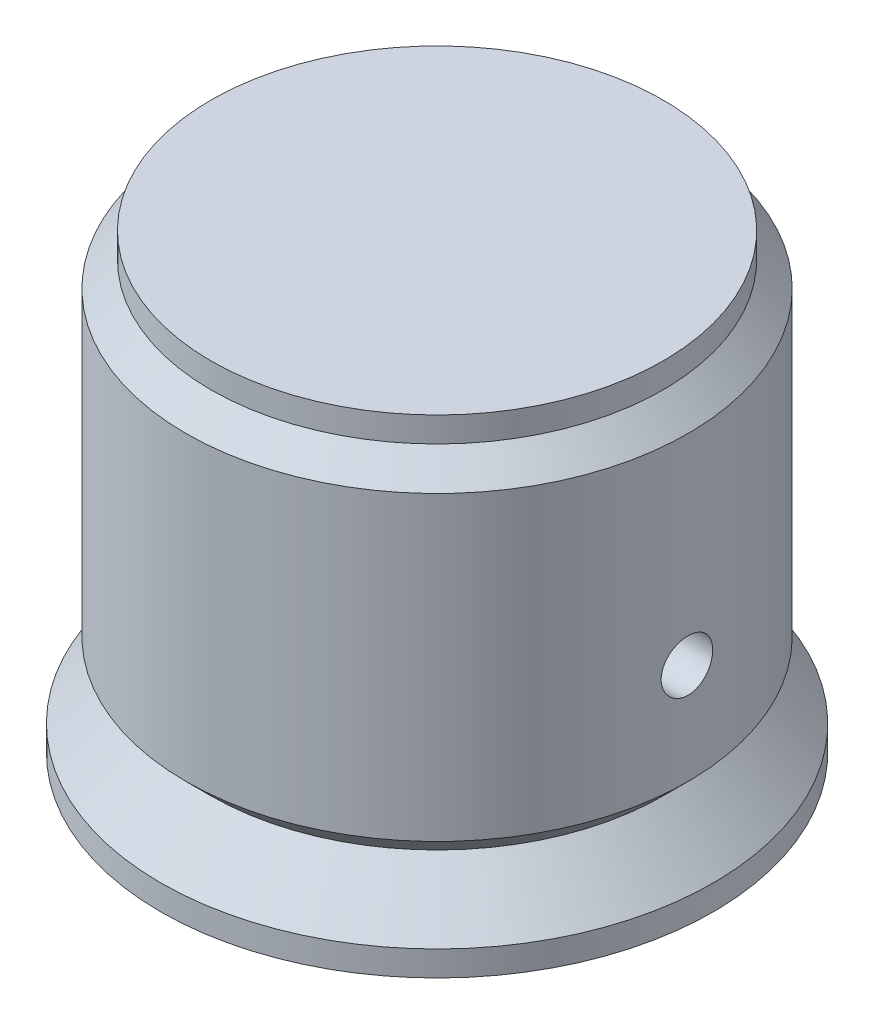
ISO-10303-21;
HEADER;
FILE_DESCRIPTION(('STEP AP214'),'2;1');
FILE_NAME('part.step','',(''),(''),'','','');
FILE_SCHEMA(('AUTOMOTIVE_DESIGN { 1 0 10303 214 1 1 1 1 }'));
ENDSEC;
DATA;
#1=APPLICATION_CONTEXT('core data for automotive mechanical design processes');
#2=APPLICATION_PROTOCOL_DEFINITION('international standard','automotive_design',2000,#1);
#3=PRODUCT_CONTEXT('',#1,'mechanical');
#4=PRODUCT('Part','Part','',(#3));
#5=PRODUCT_RELATED_PRODUCT_CATEGORY('part','',(#4));
#6=PRODUCT_DEFINITION_FORMATION('','',#4);
#7=PRODUCT_DEFINITION_CONTEXT('part definition',#1,'design');
#8=PRODUCT_DEFINITION('design','',#6,#7);
#9=PRODUCT_DEFINITION_SHAPE('','',#8);
#10=(LENGTH_UNIT() NAMED_UNIT(*) SI_UNIT(.MILLI.,.METRE.));
#11=(NAMED_UNIT(*) PLANE_ANGLE_UNIT() SI_UNIT($,.RADIAN.));
#12=(NAMED_UNIT(*) SI_UNIT($,.STERADIAN.) SOLID_ANGLE_UNIT());
#13=UNCERTAINTY_MEASURE_WITH_UNIT(LENGTH_MEASURE(1.E-05),#10,'distance_accuracy_value','');
#14=(GEOMETRIC_REPRESENTATION_CONTEXT(3) GLOBAL_UNCERTAINTY_ASSIGNED_CONTEXT((#13)) GLOBAL_UNIT_ASSIGNED_CONTEXT((#10,
#11,#12)) REPRESENTATION_CONTEXT('',''));
#15=CARTESIAN_POINT('',(0.,0.,0.));
#16=DIRECTION('',(0.,0.,1.));
#17=DIRECTION('',(1.,0.,0.));
#18=AXIS2_PLACEMENT_3D('',#15,#16,#17);
#19=CARTESIAN_POINT('',(0.,17.358883539874,0.));
#20=DIRECTION('',(0.,1.,0.));
#21=DIRECTION('',(0.,0.,1.));
#22=AXIS2_PLACEMENT_3D('',#19,#20,#21);
#23=CYLINDRICAL_SURFACE('',#22,7.9375);
#24=CARTESIAN_POINT('',(0.,12.7000000000001,0.));
#25=DIRECTION('',(0.,1.,0.));
#26=DIRECTION('',(0.,0.,1.));
#27=AXIS2_PLACEMENT_3D('',#24,#25,#26);
#28=CIRCLE('',#27,7.9375);
#29=CARTESIAN_POINT('',(0.,12.7000000000001,7.9375));
#30=VERTEX_POINT('',#29);
#31=EDGE_CURVE('E91',#30,#30,#28,.T.);
#32=ORIENTED_EDGE('',*,*,#31,.F.);
#33=EDGE_LOOP('',(#32));
#34=FACE_BOUND('',#33,.T.);
#35=CARTESIAN_POINT('',(0.,3.17500000000007,0.));
#36=DIRECTION('',(0.,1.,0.));
#37=DIRECTION('',(0.,0.,1.));
#38=AXIS2_PLACEMENT_3D('',#35,#36,#37);
#39=CIRCLE('',#38,7.9375);
#40=CARTESIAN_POINT('',(0.,3.17500000000007,7.9375));
#41=VERTEX_POINT('',#40);
#42=EDGE_CURVE('E94',#41,#41,#39,.T.);
#43=ORIENTED_EDGE('',*,*,#42,.T.);
#44=EDGE_LOOP('',(#43));
#45=FACE_BOUND('',#44,.T.);
#46=CARTESIAN_POINT('',(7.89564413364103,6.35,0.81407));
#47=CARTESIAN_POINT('',(7.89564468109291,6.30440253163848,0.81406802790347));
#48=CARTESIAN_POINT('',(7.8960433804208,6.25877506608875,0.810226105708008));
#49=CARTESIAN_POINT('',(7.89759484298477,6.16878561354159,0.794958208801477));
#50=CARTESIAN_POINT('',(7.89874843324081,6.12442507021143,0.783523916074697));
#51=CARTESIAN_POINT('',(7.90167766577613,6.0382856499606,0.753408122480469));
#52=CARTESIAN_POINT('',(7.90345292672176,5.99650520884103,0.73473106358327));
#53=CARTESIAN_POINT('',(7.90742500512262,5.91668106859674,0.690668538459444));
#54=CARTESIAN_POINT('',(7.90962173991015,5.87863663890104,0.665284387391258));
#55=CARTESIAN_POINT('',(7.91419864213506,5.80721032888699,0.608424178152562));
#56=CARTESIAN_POINT('',(7.91657940718333,5.77384472158424,0.576927724329384));
#57=CARTESIAN_POINT('',(7.92125069791733,5.71286335306415,0.508780599064153));
#58=CARTESIAN_POINT('',(7.92354121943797,5.68524785698533,0.472129690079861));
#59=CARTESIAN_POINT('',(7.92777986870166,5.63649414413376,0.39461407702642));
#60=CARTESIAN_POINT('',(7.92972722929275,5.61537036344475,0.353740247815001));
#61=CARTESIAN_POINT('',(7.93305363178316,5.58029207284229,0.269002358732026));
#62=CARTESIAN_POINT('',(7.9344326882001,5.5663373797886,0.225138375278848));
#63=CARTESIAN_POINT('',(7.93646290396252,5.54604120719977,0.13582995424628));
#64=CARTESIAN_POINT('',(7.9371166214315,5.53967296589329,0.090391657604757));
#65=CARTESIAN_POINT('',(7.93763120651779,5.53464764980265,-0.000913173853407171));
#66=CARTESIAN_POINT('',(7.93749209567592,5.53599036551511,-0.046779697001515));
#67=CARTESIAN_POINT('',(7.93643878977762,5.54632714983542,-0.137457289458856));
#68=CARTESIAN_POINT('',(7.93552750993227,5.55529244095822,-0.182271677850242));
#69=CARTESIAN_POINT('',(7.9330356160048,5.58057503870674,-0.269756328397973));
#70=CARTESIAN_POINT('',(7.93145499284316,5.59689244506266,-0.312426561460487));
#71=CARTESIAN_POINT('',(7.92779709307406,5.63644754707735,-0.394502210185458));
#72=CARTESIAN_POINT('',(7.92571890580127,5.65969795121428,-0.4339014589602));
#73=CARTESIAN_POINT('',(7.92129900507454,5.71244982575675,-0.508249449018692));
#74=CARTESIAN_POINT('',(7.91895728348936,5.74195148906707,-0.543198052908702));
#75=CARTESIAN_POINT('',(7.91426031469714,5.80653022185264,-0.607821292190341));
#76=CARTESIAN_POINT('',(7.91190505484651,5.84163232942718,-0.637470911476628));
#77=CARTESIAN_POINT('',(7.90745720744383,5.9163287949023,-0.690460794721214));
#78=CARTESIAN_POINT('',(7.90536462030596,5.95592315988601,-0.713801048731095));
#79=CARTESIAN_POINT('',(7.90167888028008,6.03849970886544,-0.753509678935898));
#80=CARTESIAN_POINT('',(7.90008584114513,6.08148266169878,-0.769876467493099));
#81=CARTESIAN_POINT('',(7.89758189888314,6.16960656703262,-0.795153557474137));
#82=CARTESIAN_POINT('',(7.89667097387245,6.21474745025279,-0.804064098111002));
#83=CARTESIAN_POINT('',(7.89563820512157,6.30568609546005,-0.814143487815304));
#84=CARTESIAN_POINT('',(7.89551279232229,6.35147993740407,-0.815347353539361));
#85=CARTESIAN_POINT('',(7.89605582706615,6.44261744044922,-0.810071221192235));
#86=CARTESIAN_POINT('',(7.89672426331588,6.48796110794533,-0.803591332431061));
#87=CARTESIAN_POINT('',(7.89877643195743,6.57680878903016,-0.78316094552791));
#88=CARTESIAN_POINT('',(7.90015857527128,6.62031665822009,-0.769227041377777));
#89=CARTESIAN_POINT('',(7.90348113527271,6.70437763318995,-0.734301109966878));
#90=CARTESIAN_POINT('',(7.90542156538965,6.74493066786316,-0.713308912919774));
#91=CARTESIAN_POINT('',(7.9096506917656,6.82209032014653,-0.664774717531622));
#92=CARTESIAN_POINT('',(7.91194061008338,6.85868228812534,-0.637209537356879));
#93=CARTESIAN_POINT('',(7.91660671122659,6.92673245344987,-0.576345034294726));
#94=CARTESIAN_POINT('',(7.91898289629806,6.95819051701295,-0.543045562025822));
#95=CARTESIAN_POINT('',(7.92356458519669,7.01520085744043,-0.471505716259486));
#96=CARTESIAN_POINT('',(7.92576940727394,7.04073027553335,-0.43324707677102));
#97=CARTESIAN_POINT('',(7.92974999614946,7.08500125991737,-0.352965011932784));
#98=CARTESIAN_POINT('',(7.93152576909061,7.10374292339367,-0.310941640496155));
#99=CARTESIAN_POINT('',(7.93444510346951,7.13386775022716,-0.224402439116637));
#100=CARTESIAN_POINT('',(7.93558984576907,7.14526466478532,-0.179891437508692));
#101=CARTESIAN_POINT('',(7.93712298782111,7.16042134345621,-0.0895752627449945));
#102=CARTESIAN_POINT('',(7.93751141001073,7.16418133412742,-0.0437701280221218));
#103=CARTESIAN_POINT('',(7.93748812699836,7.16395415189939,0.0476096710313823));
#104=CARTESIAN_POINT('',(7.93708008447076,7.16000244254339,0.0931844286057211));
#105=CARTESIAN_POINT('',(7.93551695177803,7.14453846832315,0.183018983675443));
#106=CARTESIAN_POINT('',(7.93436186111154,7.13302619838495,0.227278780288323));
#107=CARTESIAN_POINT('',(7.93143402816378,7.10277784517621,0.313226353267183));
#108=CARTESIAN_POINT('',(7.92966137998366,7.0840428624299,0.354914520350163));
#109=CARTESIAN_POINT('',(7.92569590825516,7.03988466253966,0.434560155135824));
#110=CARTESIAN_POINT('',(7.92350308646436,7.01446147337242,0.472517638442998));
#111=CARTESIAN_POINT('',(7.91893078634962,6.95751567656581,0.543806143886235));
#112=CARTESIAN_POINT('',(7.9165505272709,6.92596665629662,0.577116017842415));
#113=CARTESIAN_POINT('',(7.91187819789077,6.85771723011136,0.637984428179433));
#114=CARTESIAN_POINT('',(7.90958614886003,6.82101559150491,0.665541584369779));
#115=CARTESIAN_POINT('',(7.90534323030337,6.74339526672109,0.71418075970169));
#116=CARTESIAN_POINT('',(7.90339328461807,6.70246562191014,0.735245358393));
#117=CARTESIAN_POINT('',(7.90006633585198,6.61765600518286,0.770174528193216));
#118=CARTESIAN_POINT('',(7.89868868899701,6.57377941318531,0.784047193829108));
#119=CARTESIAN_POINT('',(7.89700856126118,6.49971354998323,0.800751932054745));
#120=CARTESIAN_POINT('',(7.89649933226807,6.46999726250919,0.805739349712897));
#121=CARTESIAN_POINT('',(7.89581693850272,6.41019167349721,0.81239902723173));
#122=CARTESIAN_POINT('',(7.89564377222621,6.38010237362954,0.814071301931636));
#123=CARTESIAN_POINT('',(7.89564413364103,6.35,0.81407));
#124=B_SPLINE_CURVE_WITH_KNOTS('',3,(#46,#47,#48,#49,#50,#51,#52,#53,#54,#55,#56,#57,#58,#59,
#60,#61,#62,#63,#64,#65,#66,#67,#68,#69,#70,#71,#72,#73,#74,#75,#76,#77,#78,#79,#80,#81,#82,#83,
#84,#85,#86,#87,#88,#89,#90,#91,#92,#93,#94,#95,#96,#97,#98,#99,#100,#101,#102,#103,#104,#105,
#106,#107,#108,#109,#110,#111,#112,#113,#114,#115,#116,#117,#118,#119,#120,#121,#122,#123),
.UNSPECIFIED.,.T.,.F.,(4,2,2,2,2,2,2,2,2,2,2,2,2,2,2,2,2,2,2,2,2,2,2,2,2,2,2,2,2,2,2,2,2,2,2,2,
2,2,4),(0.,0.136682472955473,0.273514939511281,0.4102636194424,0.54698550491758,
0.684171704542125,0.821364228443609,0.958859665500757,1.09635158994918,1.23335705152,
1.37035879072914,1.50684559267245,1.6433342460919,1.78007464326849,1.91681926067009,
2.05419330257295,2.19156756108182,2.32897307867804,2.46637418783042,2.60315054467964,
2.7399249557554,2.87639614157998,3.0128706104365,3.14983371311383,3.28680038429593,
3.42428669355732,3.56177103424977,3.69899721637305,3.8362193274583,3.97281188656289,
4.10940453733612,4.24597638371747,4.38254765882954,4.51972141380645,4.65692804174563,
4.7944996725156,4.93191612829222,5.02215107849102,5.11238562477971),.UNSPECIFIED.);
#125=CARTESIAN_POINT('',(7.89564413364103,6.35,0.81407));
#126=VERTEX_POINT('',#125);
#127=EDGE_CURVE('E62',#126,#126,#124,.T.);
#128=ORIENTED_EDGE('',*,*,#127,.F.);
#129=EDGE_LOOP('',(#128));
#130=FACE_BOUND('',#129,.T.);
#131=CARTESIAN_POINT('',(0.370839999999999,6.35,-7.92883244522168));
#132=CARTESIAN_POINT('',(0.370839080629376,6.32918195396878,-7.92883256175939));
#133=CARTESIAN_POINT('',(0.369081102022683,6.30834910224734,-7.92891531657544));
#134=CARTESIAN_POINT('',(0.362093040686296,6.2672579834189,-7.92923745655852));
#135=CARTESIAN_POINT('',(0.3568588557554,6.24700042469036,-7.92947702677544));
#136=CARTESIAN_POINT('',(0.343068462823972,6.20766109196465,-7.9300856011463));
#137=CARTESIAN_POINT('',(0.334513934757569,6.18857872902292,-7.93045453983689));
#138=CARTESIAN_POINT('',(0.314328233402319,6.15212603971653,-7.93128019634848));
#139=CARTESIAN_POINT('',(0.302697791258877,6.13475530784186,-7.93173689330227));
#140=CARTESIAN_POINT('',(0.27667866068903,6.10219809670747,-7.93268707752746));
#141=CARTESIAN_POINT('',(0.262287809564703,6.08701334653674,-7.93318059345894));
#142=CARTESIAN_POINT('',(0.231160630972655,6.05927385883718,-7.9341485339307));
#143=CARTESIAN_POINT('',(0.214424208278664,6.04671922813844,-7.93462295769486));
#144=CARTESIAN_POINT('',(0.179072208506809,6.02459182456322,-7.93549946053554));
#145=CARTESIAN_POINT('',(0.160455809080545,6.01502036414527,-7.93590150773692));
#146=CARTESIAN_POINT('',(0.121878104687698,5.99913943322996,-7.93658766571116));
#147=CARTESIAN_POINT('',(0.10191680895015,5.99282994035069,-7.93687177729323));
#148=CARTESIAN_POINT('',(0.0612315349410088,5.98365652105965,-7.93728985784329));
#149=CARTESIAN_POINT('',(0.0405081297483858,5.98079005808697,-7.93742393733846));
#150=CARTESIAN_POINT('',(-0.00112611881939083,5.97857624053612,-7.93752721399483));
#151=CARTESIAN_POINT('',(-0.022036960862524,5.97922886096934,-7.93749641232683));
#152=CARTESIAN_POINT('',(-0.0634353255926469,5.98403257555942,-7.93727349114915));
#153=CARTESIAN_POINT('',(-0.0839231659486635,5.9881809386996,-7.93708149756959));
#154=CARTESIAN_POINT('',(-0.123911352378555,5.99985414967082,-7.93655796580004));
#155=CARTESIAN_POINT('',(-0.143411694699312,6.00737901033362,-7.93622642707975));
#156=CARTESIAN_POINT('',(-0.180880138765977,6.02559473140008,-7.9354609377573));
#157=CARTESIAN_POINT('',(-0.198847634000562,6.03628683759309,-7.93502694687077));
#158=CARTESIAN_POINT('',(-0.232733720927134,6.06053262850446,-7.93410543440014));
#159=CARTESIAN_POINT('',(-0.248652300088203,6.07408633072263,-7.93361791248869));
#160=CARTESIAN_POINT('',(-0.278004610420386,6.10368601642566,-7.93264369823141));
#161=CARTESIAN_POINT('',(-0.291435952498045,6.11973436919326,-7.93215700712353));
#162=CARTESIAN_POINT('',(-0.315414120398659,6.15385947298856,-7.93123979146471));
#163=CARTESIAN_POINT('',(-0.325960945524975,6.17193622450613,-7.93080926692733));
#164=CARTESIAN_POINT('',(-0.343870475815803,6.20960641667686,-7.93005296899816));
#165=CARTESIAN_POINT('',(-0.351233093586188,6.22919989894099,-7.92972719848153));
#166=CARTESIAN_POINT('',(-0.362563627496525,6.26934672339646,-7.92921725698598));
#167=CARTESIAN_POINT('',(-0.36653156593164,6.28990005928286,-7.9290330850771));
#168=CARTESIAN_POINT('',(-0.370957155855866,6.33136235108357,-7.9288272808435));
#169=CARTESIAN_POINT('',(-0.371418122139988,6.35227095245648,-7.92880549503162));
#170=CARTESIAN_POINT('',(-0.36882533059459,6.39386854346187,-7.92892651907982));
#171=CARTESIAN_POINT('',(-0.365771582888321,6.41455753372672,-7.92906932846583));
#172=CARTESIAN_POINT('',(-0.356238796455571,6.4551193197343,-7.92950330630611));
#173=CARTESIAN_POINT('',(-0.349761272822283,6.47499247231369,-7.92979440913533));
#174=CARTESIAN_POINT('',(-0.333566341164042,6.51336944327817,-7.93049210695634));
#175=CARTESIAN_POINT('',(-0.323848916803876,6.53187325475862,-7.93089870253042));
#176=CARTESIAN_POINT('',(-0.301441510574862,6.56700154273237,-7.93178193098113));
#177=CARTESIAN_POINT('',(-0.288749300854043,6.58362459680163,-7.93225861624857));
#178=CARTESIAN_POINT('',(-0.260755867000123,6.61450519843412,-7.93322811031755));
#179=CARTESIAN_POINT('',(-0.245454628179618,6.62876273267986,-7.93372091920985));
#180=CARTESIAN_POINT('',(-0.21266325217161,6.6545187005534,-7.93466756251915));
#181=CARTESIAN_POINT('',(-0.195171432861411,6.66601499384406,-7.93512136652823));
#182=CARTESIAN_POINT('',(-0.158503939131434,6.68590751201515,-7.93593841949101));
#183=CARTESIAN_POINT('',(-0.139328271344498,6.69430374910633,-7.9363016688014));
#184=CARTESIAN_POINT('',(-0.0998453907621061,6.70775407032865,-7.93689652688952));
#185=CARTESIAN_POINT('',(-0.0795386464096146,6.71280952706984,-7.93712818972605));
#186=CARTESIAN_POINT('',(-0.0383634754865777,6.71943927767649,-7.93743398028897));
#187=CARTESIAN_POINT('',(-0.0174950515543699,6.72101358789082,-7.9375081087552));
#188=CARTESIAN_POINT('',(0.0241898383166901,6.72063619645344,-7.93749047959719));
#189=CARTESIAN_POINT('',(0.0450063348205549,6.71868785422109,-7.93739888002141));
#190=CARTESIAN_POINT('',(0.0860163586718094,6.71132740328385,-7.9370604195519));
#191=CARTESIAN_POINT('',(0.106209884831346,6.70591528797482,-7.93681355836215));
#192=CARTESIAN_POINT('',(0.145401513084015,6.69178158520094,-7.93619235433271));
#193=CARTESIAN_POINT('',(0.164399603457268,6.68305996529608,-7.93581801024344));
#194=CARTESIAN_POINT('',(0.200661961476951,6.66255545909244,-7.93498395607226));
#195=CARTESIAN_POINT('',(0.217926284194516,6.65077267007086,-7.93452424870315));
#196=CARTESIAN_POINT('',(0.250247707269562,6.62446844151825,-7.93357072563952));
#197=CARTESIAN_POINT('',(0.265302930586764,6.60994469671459,-7.93307688145752));
#198=CARTESIAN_POINT('',(0.292766055180167,6.57857165871008,-7.9321109210063));
#199=CARTESIAN_POINT('',(0.305173303391363,6.56172179350618,-7.93163881011958));
#200=CARTESIAN_POINT('',(0.326993359407993,6.52616289752461,-7.93076927665154));
#201=CARTESIAN_POINT('',(0.336403470199974,6.50745221201615,-7.93037192147097));
#202=CARTESIAN_POINT('',(0.351937509486823,6.4687287428102,-7.92969780403419));
#203=CARTESIAN_POINT('',(0.358065326924197,6.44871753168598,-7.92942089913895));
#204=CARTESIAN_POINT('',(0.365250190498418,6.41548464224972,-7.92909236525569));
#205=CARTESIAN_POINT('',(0.367343700542568,6.40247831387027,-7.92899532383336));
#206=CARTESIAN_POINT('',(0.370138895392648,6.37631662944878,-7.92886532700226));
#207=CARTESIAN_POINT('',(0.370840581230736,6.36316127351726,-7.92883237154595));
#208=CARTESIAN_POINT('',(0.370839999999999,6.35,-7.92883244522168));
#209=B_SPLINE_CURVE_WITH_KNOTS('',3,(#131,#132,#133,#134,#135,#136,#137,#138,#139,#140,#141,
#142,#143,#144,#145,#146,#147,#148,#149,#150,#151,#152,#153,#154,#155,#156,#157,#158,#159,#160,
#161,#162,#163,#164,#165,#166,#167,#168,#169,#170,#171,#172,#173,#174,#175,#176,#177,#178,#179,
#180,#181,#182,#183,#184,#185,#186,#187,#188,#189,#190,#191,#192,#193,#194,#195,#196,#197,#198,
#199,#200,#201,#202,#203,#204,#205,#206,#207,#208),.UNSPECIFIED.,.T.,.F.,(4,2,2,2,2,2,2,2,2,2,2,
2,2,2,2,2,2,2,2,2,2,2,2,2,2,2,2,2,2,2,2,2,2,2,2,2,2,2,4),(0.,0.062406095052127,
0.124885965449896,0.187334265155297,0.249767734207714,0.312250319296842,0.374735441809307,
0.437248016239672,0.499760161735841,0.56222622476489,0.624691844230104,0.687108708201454,
0.749525809378565,0.811967494076251,0.874409560641415,0.93691129774721,0.999413049947793,
1.06191651746993,1.12441957448625,1.18686354617654,1.24930733801309,1.3117235202584,
1.37414001720381,1.43660340881404,1.49906715207054,1.56157915808335,1.62409091786642,
1.68657697775398,1.74906274418141,1.81148895174377,1.87391527833043,1.9363422168405,
1.99876717180305,2.06124486497272,2.1237379491348,2.18628711067002,2.24876199755279,
2.28821547431,2.32766892180902),.UNSPECIFIED.);
#210=CARTESIAN_POINT('',(0.370839999999999,6.35,-7.92883244522168));
#211=VERTEX_POINT('',#210);
#212=EDGE_CURVE('E105',#211,#211,#209,.T.);
#213=ORIENTED_EDGE('',*,*,#212,.F.);
#214=EDGE_LOOP('',(#213));
#215=FACE_BOUND('',#214,.T.);
#216=ADVANCED_FACE('F34',(#34,#45,#130,#215),#23,.T.);
#217=CARTESIAN_POINT('',(0.,13.9527184525262,0.));
#218=DIRECTION('',(0.,1.,0.));
#219=DIRECTION('',(0.,0.,1.));
#220=AXIS2_PLACEMENT_3D('',#217,#218,#219);
#221=CYLINDRICAL_SURFACE('',#220,1.58496);
#222=CARTESIAN_POINT('',(1.35992214361705,6.35,0.81407));
#223=CARTESIAN_POINT('',(1.35992612065892,6.30776314922456,0.814066908978174));
#224=CARTESIAN_POINT('',(1.36192010270824,6.2654771237093,0.810760707444039));
#225=CARTESIAN_POINT('',(1.36960159336504,6.1822177605981,0.797711242912232));
#226=CARTESIAN_POINT('',(1.37529643623231,6.14124719950893,0.787955197132207));
#227=CARTESIAN_POINT('',(1.38954241712213,6.06198227533883,0.762547609008894));
#228=CARTESIAN_POINT('',(1.39807767549821,6.02367443424069,0.746928782398431));
#229=CARTESIAN_POINT('',(1.41701787380313,5.95023328541698,0.71033916161101));
#230=CARTESIAN_POINT('',(1.42742300074322,5.91510029574662,0.689367832025708));
#231=CARTESIAN_POINT('',(1.45003891920265,5.84562238787105,0.640523350818725));
#232=CARTESIAN_POINT('',(1.46232804468082,5.81161406992609,0.612207478629607));
#233=CARTESIAN_POINT('',(1.48669627149703,5.74856512363122,0.550396662868948));
#234=CARTESIAN_POINT('',(1.49877526004208,5.71952709345629,0.516899027887078));
#235=CARTESIAN_POINT('',(1.52240301915531,5.66519033977281,0.442726739270781));
#236=CARTESIAN_POINT('',(1.53385076444485,5.64031218940175,0.401708751839552));
#237=CARTESIAN_POINT('',(1.55389748148695,5.59796407409545,0.31537114846339));
#238=CARTESIAN_POINT('',(1.56249834778946,5.58048918024136,0.27005441920128));
#239=CARTESIAN_POINT('',(1.5753156251807,5.55479858564078,0.179977350834811));
#240=CARTESIAN_POINT('',(1.57981062621465,5.54599074068908,0.135426451484196));
#241=CARTESIAN_POINT('',(1.58495498655493,5.53592754470505,0.0452706119242485));
#242=CARTESIAN_POINT('',(1.58560682204381,5.53466733066501,-0.000333630585192907));
#243=CARTESIAN_POINT('',(1.58311738903937,5.53952193144449,-0.0868218104513265));
#244=CARTESIAN_POINT('',(1.58031825699849,5.54497146144357,-0.127755326833186));
#245=CARTESIAN_POINT('',(1.5717667840328,5.56189101813025,-0.208031362415121));
#246=CARTESIAN_POINT('',(1.56601422095463,5.57336149770756,-0.247373761693187));
#247=CARTESIAN_POINT('',(1.55198355097381,5.602054240069,-0.324013152237427));
#248=CARTESIAN_POINT('',(1.54367316109199,5.619350308698,-0.36127635647252));
#249=CARTESIAN_POINT('',(1.52526460378324,5.65909207460375,-0.432457731990654));
#250=CARTESIAN_POINT('',(1.51516581018912,5.68153957634992,-0.46637472517954));
#251=CARTESIAN_POINT('',(1.49294547929317,5.73347579749018,-0.533460350137879));
#252=CARTESIAN_POINT('',(1.48072269031024,5.76343972619085,-0.566227779566969));
#253=CARTESIAN_POINT('',(1.4562493468828,5.82829505373244,-0.626495182750096));
#254=CARTESIAN_POINT('',(1.44399877775013,5.86319056349066,-0.653990716376198));
#255=CARTESIAN_POINT('',(1.41991882513928,5.93988307701172,-0.704822154040848));
#256=CARTESIAN_POINT('',(1.40817833836587,5.98199161396138,-0.727734459648675));
#257=CARTESIAN_POINT('',(1.38774893354004,6.07019947473602,-0.765980200564892));
#258=CARTESIAN_POINT('',(1.37905670337108,6.1162943987691,-0.781321869260279));
#259=CARTESIAN_POINT('',(1.36670896023168,6.20728699436215,-0.80271234630527));
#260=CARTESIAN_POINT('',(1.36270473875072,6.2519830549736,-0.809409025360121));
#261=CARTESIAN_POINT('',(1.35920389704323,6.34202786357491,-0.815277461457499));
#262=CARTESIAN_POINT('',(1.35970366056535,6.38737605876039,-0.814455255408067));
#263=CARTESIAN_POINT('',(1.3647835636091,6.47169450318998,-0.805903905678212));
#264=CARTESIAN_POINT('',(1.36887307340362,6.51078365739502,-0.799004927500506));
#265=CARTESIAN_POINT('',(1.37992977113407,6.58716625327773,-0.779752726063341));
#266=CARTESIAN_POINT('',(1.38689796121188,6.62445906454939,-0.767397603277627));
#267=CARTESIAN_POINT('',(1.40329645280003,6.69814416338469,-0.736998744905182));
#268=CARTESIAN_POINT('',(1.41282492240653,6.7344169323808,-0.718720337113924));
#269=CARTESIAN_POINT('',(1.4331923476364,6.80359342345647,-0.677194597564889));
#270=CARTESIAN_POINT('',(1.44403197699959,6.83649539727699,-0.653944706457718));
#271=CARTESIAN_POINT('',(1.46755083813959,6.9026277630366,-0.599487334692971));
#272=CARTESIAN_POINT('',(1.48028144580628,6.93530744677591,-0.567630219484873));
#273=CARTESIAN_POINT('',(1.50490105312404,6.99504274893005,-0.498708495833169));
#274=CARTESIAN_POINT('',(1.51678971580493,7.02209612383266,-0.461641819892416));
#275=CARTESIAN_POINT('',(1.538872990144,7.07057114653636,-0.381755944156428));
#276=CARTESIAN_POINT('',(1.54900085442567,7.09178378558537,-0.338790120183431));
#277=CARTESIAN_POINT('',(1.56590288629133,7.12646269085746,-0.249229867530514));
#278=CARTESIAN_POINT('',(1.57268015383729,7.13993611925031,-0.202638839253551));
#279=CARTESIAN_POINT('',(1.58159738918186,7.15753520602376,-0.111918235443605));
#280=CARTESIAN_POINT('',(1.58411615608745,7.16242613048755,-0.0679742020083088));
#281=CARTESIAN_POINT('',(1.58544343413771,7.16501205530246,0.020174487405881));
#282=CARTESIAN_POINT('',(1.58425339759034,7.16270987235817,0.0643790346053943));
#283=CARTESIAN_POINT('',(1.5785162040543,7.15146451849727,0.148436665647271));
#284=CARTESIAN_POINT('',(1.57421663732349,7.14301085708373,0.188374064600209));
#285=CARTESIAN_POINT('',(1.56294204881552,7.12038662120451,0.266189665476463));
#286=CARTESIAN_POINT('',(1.55596666271265,7.10621526823393,0.304067586189708));
#287=CARTESIAN_POINT('',(1.539606617523,7.07196649894194,0.378443438325365));
#288=CARTESIAN_POINT('',(1.53013487629134,7.05167068486198,0.41482105005805));
#289=CARTESIAN_POINT('',(1.50974599916449,7.00601955578178,0.483798486617463));
#290=CARTESIAN_POINT('',(1.49882821049724,6.98066195316109,0.516396592769152));
#291=CARTESIAN_POINT('',(1.47527257358154,6.92255438603668,0.580475618924149));
#292=CARTESIAN_POINT('',(1.46257400872301,6.88930956693405,0.611486586329259));
#293=CARTESIAN_POINT('',(1.43779237265358,6.81795017951509,0.667680198848413));
#294=CARTESIAN_POINT('',(1.42570990792815,6.77983093752659,0.69285718423153));
#295=CARTESIAN_POINT('',(1.40312219530424,6.6978196691344,0.737563314194053));
#296=CARTESIAN_POINT('',(1.39270004280659,6.65375700334378,0.756824230293514));
#297=CARTESIAN_POINT('',(1.37567394353492,6.56232606278449,0.78735782663135));
#298=CARTESIAN_POINT('',(1.36905731304127,6.51496936561103,0.798657071627598));
#299=CARTESIAN_POINT('',(1.36327824209394,6.44754313587066,0.808441951908185));
#300=CARTESIAN_POINT('',(1.36202479078346,6.42811993154273,0.810548766135798));
#301=CARTESIAN_POINT('',(1.36034579318792,6.38913467737352,0.813363551779782));
#302=CARTESIAN_POINT('',(1.35992030065002,6.36957261860118,0.814071432384048));
#303=CARTESIAN_POINT('',(1.35992214361705,6.35,0.81407));
#304=B_SPLINE_CURVE_WITH_KNOTS('',3,(#222,#223,#224,#225,#226,#227,#228,#229,#230,#231,#232,
#233,#234,#235,#236,#237,#238,#239,#240,#241,#242,#243,#244,#245,#246,#247,#248,#249,#250,#251,
#252,#253,#254,#255,#256,#257,#258,#259,#260,#261,#262,#263,#264,#265,#266,#267,#268,#269,#270,
#271,#272,#273,#274,#275,#276,#277,#278,#279,#280,#281,#282,#283,#284,#285,#286,#287,#288,#289,
#290,#291,#292,#293,#294,#295,#296,#297,#298,#299,#300,#301,#302,#303),.UNSPECIFIED.,.T.,.F.,(4,
2,2,2,2,2,2,2,2,2,2,2,2,2,2,2,2,2,2,2,2,2,2,2,2,2,2,2,2,2,2,2,2,2,2,2,2,2,2,2,4),(0.,
0.126628065691581,0.253507847689161,0.379689888509127,0.505884556209157,0.64309680078727,
0.780380554267218,0.927562770160037,1.07464684091657,1.21078807622245,1.34684158503882,
1.47042676343881,1.59402123912281,1.71924446107889,1.84451161397714,1.9820908766689,
2.11978550805488,2.26707911718735,2.41421218331937,2.54951799830424,2.68471518588099,
2.80388869362434,2.92310372370713,3.04778011912611,3.17252085389612,3.31403446711626,
3.45560440169314,3.60172553596039,3.74771122521133,3.87985352264853,4.01194408178369,
4.13453503578093,4.25714268705579,4.38477909240135,4.51247331277003,4.65346686600962,
4.7945966341913,4.94140898280282,5.0877291303965,5.14640495294277,5.20508458431877),.UNSPECIFIED.);
#305=CARTESIAN_POINT('',(1.35992214361705,6.35,0.81407));
#306=VERTEX_POINT('',#305);
#307=EDGE_CURVE('E68',#306,#306,#304,.T.);
#308=ORIENTED_EDGE('',*,*,#307,.T.);
#309=EDGE_LOOP('',(#308));
#310=FACE_BOUND('',#309,.T.);
#311=CARTESIAN_POINT('',(0.,12.444481627813,0.));
#312=DIRECTION('',(0.,1.,0.));
#313=DIRECTION('',(0.,0.,1.));
#314=AXIS2_PLACEMENT_3D('',#311,#312,#313);
#315=CIRCLE('',#314,1.58496);
#316=CARTESIAN_POINT('',(0.,12.444481627813,1.58496));
#317=VERTEX_POINT('',#316);
#318=EDGE_CURVE('E65',#317,#317,#315,.T.);
#319=ORIENTED_EDGE('',*,*,#318,.T.);
#320=EDGE_LOOP('',(#319));
#321=FACE_BOUND('',#320,.T.);
#322=CARTESIAN_POINT('',(0.,0.635,0.));
#323=DIRECTION('',(0.,1.,0.));
#324=DIRECTION('',(0.,0.,1.));
#325=AXIS2_PLACEMENT_3D('',#322,#323,#324);
#326=CIRCLE('',#325,1.58496);
#327=CARTESIAN_POINT('',(0.,0.635,1.58496));
#328=VERTEX_POINT('',#327);
#329=EDGE_CURVE('E79',#328,#328,#326,.T.);
#330=ORIENTED_EDGE('',*,*,#329,.F.);
#331=EDGE_LOOP('',(#330));
#332=FACE_BOUND('',#331,.T.);
#333=CARTESIAN_POINT('',(0.370839999999999,6.35,-1.54096589709182));
#334=CARTESIAN_POINT('',(0.370839347995944,6.32947801893924,-1.54096630696506));
#335=CARTESIAN_POINT('',(0.369130696828503,6.30894850647447,-1.54138032404446));
#336=CARTESIAN_POINT('',(0.362350315011639,6.26847599704699,-1.54298806175049));
#337=CARTESIAN_POINT('',(0.357276378204728,6.24853339380313,-1.54418229384971));
#338=CARTESIAN_POINT('',(0.343936162161487,6.2098259716214,-1.54720797275914));
#339=CARTESIAN_POINT('',(0.335673675824815,6.19105978400792,-1.54903866222389));
#340=CARTESIAN_POINT('',(0.316202108143277,6.15517873606654,-1.55313005799906));
#341=CARTESIAN_POINT('',(0.304992998648813,6.13806389151633,-1.55539076841748));
#342=CARTESIAN_POINT('',(0.27971553642252,6.10564094572626,-1.56013627676071));
#343=CARTESIAN_POINT('',(0.265600904813718,6.09036938737187,-1.56262428474344));
#344=CARTESIAN_POINT('',(0.235012865971802,6.06238745377849,-1.56751607296519));
#345=CARTESIAN_POINT('',(0.218539258665672,6.04967729600121,-1.5699198460384));
#346=CARTESIAN_POINT('',(0.183453343143141,6.02703205658517,-1.57440755228907));
#347=CARTESIAN_POINT('',(0.164817531499513,6.01713247991362,-1.57648725541644));
#348=CARTESIAN_POINT('',(0.126089804245488,6.0006196586394,-1.58005606420538));
#349=CARTESIAN_POINT('',(0.105998076507663,5.99400599088268,-1.58154524590834));
#350=CARTESIAN_POINT('',(0.0653093158834763,5.98436866207585,-1.58374253303524));
#351=CARTESIAN_POINT('',(0.044727695714655,5.98128305041812,-1.58446410102964));
#352=CARTESIAN_POINT('',(0.00332713925491686,5.97859536817375,-1.58509163113539));
#353=CARTESIAN_POINT('',(-0.0174917657873284,5.97899284406497,-1.58499769943046));
#354=CARTESIAN_POINT('',(-0.0583476319688347,5.98321466045703,-1.58401497661583));
#355=CARTESIAN_POINT('',(-0.0783919259506574,5.98697218301305,-1.58314168455008));
#356=CARTESIAN_POINT('',(-0.117557247436947,5.99770051857316,-1.58071620225859));
#357=CARTESIAN_POINT('',(-0.136678229416692,6.00467148984084,-1.5791639785954));
#358=CARTESIAN_POINT('',(-0.17363516572913,6.02168554284616,-1.57553068676746));
#359=CARTESIAN_POINT('',(-0.191459367597353,6.03175321671799,-1.57344540865032));
#360=CARTESIAN_POINT('',(-0.225189258548769,6.05465641115017,-1.56897352092403));
#361=CARTESIAN_POINT('',(-0.241094650983439,6.06749235883357,-1.56658686483819));
#362=CARTESIAN_POINT('',(-0.270933418624909,6.09592893334846,-1.56170663259337));
#363=CARTESIAN_POINT('',(-0.284810948991198,6.11158801089006,-1.55921186339564));
#364=CARTESIAN_POINT('',(-0.309754454760198,6.14503720062716,-1.55444913087749));
#365=CARTESIAN_POINT('',(-0.320820329960056,6.16282738873877,-1.55218117564211));
#366=CARTESIAN_POINT('',(-0.339856290485879,6.20013310155467,-1.54812513413767));
#367=CARTESIAN_POINT('',(-0.347814469448358,6.21965491693133,-1.54633890139529));
#368=CARTESIAN_POINT('',(-0.360319604940793,6.25981083366908,-1.54347321912973));
#369=CARTESIAN_POINT('',(-0.364867190168459,6.28044472928089,-1.54239363934912));
#370=CARTESIAN_POINT('',(-0.370332603935254,6.32172519961703,-1.54109044039087));
#371=CARTESIAN_POINT('',(-0.371332338451575,6.34236033349309,-1.54084751021819));
#372=CARTESIAN_POINT('',(-0.369896599330102,6.38350246228052,-1.54119279937461));
#373=CARTESIAN_POINT('',(-0.367461398907811,6.40400946725298,-1.54178095259915));
#374=CARTESIAN_POINT('',(-0.359296347880222,6.44401917261508,-1.54370377381655));
#375=CARTESIAN_POINT('',(-0.353612814262092,6.46353187724125,-1.54502794008118));
#376=CARTESIAN_POINT('',(-0.339163144139753,6.50132788543472,-1.54826387905067));
#377=CARTESIAN_POINT('',(-0.330396678507157,6.51961105749095,-1.55017571449131));
#378=CARTESIAN_POINT('',(-0.309853823455413,6.55477996978465,-1.55441316645259));
#379=CARTESIAN_POINT('',(-0.298027678832172,6.5716358317233,-1.5567454086437));
#380=CARTESIAN_POINT('',(-0.271765225389978,6.60315387828553,-1.5615440026682));
#381=CARTESIAN_POINT('',(-0.257328543186265,6.61781574855391,-1.56401037365068));
#382=CARTESIAN_POINT('',(-0.225881669914568,6.64485405215697,-1.56886383236543));
#383=CARTESIAN_POINT('',(-0.208822608456236,6.65717425219789,-1.57124805513671));
#384=CARTESIAN_POINT('',(-0.172829727236268,6.67877442267223,-1.57561296836185));
#385=CARTESIAN_POINT('',(-0.153896000951417,6.68805454459435,-1.57759367892107));
#386=CARTESIAN_POINT('',(-0.114816644098259,6.70323610266735,-1.58091646738379));
#387=CARTESIAN_POINT('',(-0.0946803243746889,6.70916051417409,-1.58226287715569));
#388=CARTESIAN_POINT('',(-0.0536627329734524,6.7175330662241,-1.58418420813143));
#389=CARTESIAN_POINT('',(-0.0327815867701497,6.71998178947721,-1.58475925865514));
#390=CARTESIAN_POINT('',(0.00860178639271329,6.72130412213142,-1.58506855721514));
#391=CARTESIAN_POINT('',(0.0291012424024183,6.72026121414749,-1.58482243933742));
#392=CARTESIAN_POINT('',(0.069624088386272,6.71481873487954,-1.58355981592681));
#393=CARTESIAN_POINT('',(0.0896474894230839,6.71041924167532,-1.58254332831402));
#394=CARTESIAN_POINT('',(0.128574425182365,6.69843083050547,-1.57985639435996));
#395=CARTESIAN_POINT('',(0.147482286290005,6.69085530495122,-1.57818869598916));
#396=CARTESIAN_POINT('',(0.183768872005281,6.67274238382975,-1.57437620845288));
#397=CARTESIAN_POINT('',(0.20114742585008,6.66220465805211,-1.57223136610348));
#398=CARTESIAN_POINT('',(0.234284074225159,6.63820255238507,-1.56764002534119));
#399=CARTESIAN_POINT('',(0.249999578602812,6.62468041650877,-1.56518805785692));
#400=CARTESIAN_POINT('',(0.278966833455914,6.59520779969449,-1.56028588085512));
#401=CARTESIAN_POINT('',(0.292217976337795,6.57925672165412,-1.5578356719191));
#402=CARTESIAN_POINT('',(0.316083960240216,6.54507579358261,-1.55317085482128));
#403=CARTESIAN_POINT('',(0.326653858565143,6.52681393195501,-1.55096057888648));
#404=CARTESIAN_POINT('',(0.344557660678308,6.48872421117478,-1.54708201354384));
#405=CARTESIAN_POINT('',(0.351894125076527,6.46889760589367,-1.54541329554442));
#406=CARTESIAN_POINT('',(0.361914455264618,6.43256273056178,-1.54309310549824));
#407=CARTESIAN_POINT('',(0.365254714220107,6.41624131003015,-1.54230102190743));
#408=CARTESIAN_POINT('',(0.369717679798756,6.38328156389819,-1.54123726820472));
#409=CARTESIAN_POINT('',(0.370840528773129,6.36664325871017,-1.54096556468598));
#410=CARTESIAN_POINT('',(0.370839999999999,6.35,-1.54096589709182));
#411=B_SPLINE_CURVE_WITH_KNOTS('',3,(#333,#334,#335,#336,#337,#338,#339,#340,#341,#342,#343,
#344,#345,#346,#347,#348,#349,#350,#351,#352,#353,#354,#355,#356,#357,#358,#359,#360,#361,#362,
#363,#364,#365,#366,#367,#368,#369,#370,#371,#372,#373,#374,#375,#376,#377,#378,#379,#380,#381,
#382,#383,#384,#385,#386,#387,#388,#389,#390,#391,#392,#393,#394,#395,#396,#397,#398,#399,#400,
#401,#402,#403,#404,#405,#406,#407,#408,#409,#410),.UNSPECIFIED.,.T.,.F.,(4,2,2,2,2,2,2,2,2,2,2,
2,2,2,2,2,2,2,2,2,2,2,2,2,2,2,2,2,2,2,2,2,2,2,2,2,2,2,4),(0.,0.0615048911940329,
0.123050142638364,0.184522408241352,0.24599526112081,0.308535792912763,0.371081632132019,
0.434385607933298,0.497681429436169,0.559847868712644,0.622006213608225,0.682955306719265,
0.743907401917642,0.805356616482063,0.866815318972335,0.929734517225571,0.992655957503103,
1.05581615436893,1.11896470562674,1.18064556315413,1.24232151484882,1.30313923817769,
1.3639634562715,1.42584684029312,1.48773908249611,1.55096877415799,1.61419531457147,
1.67698356393196,1.73976128540516,1.80104885466734,1.86233499832156,1.92336527466103,
1.98440235703259,2.046744435959,2.10910186513901,2.17244415613769,2.23573619479634,
2.28561966044269,2.33549992361283),.UNSPECIFIED.);
#412=CARTESIAN_POINT('',(0.370839999999999,6.35,-1.54096589709182));
#413=VERTEX_POINT('',#412);
#414=EDGE_CURVE('E38',#413,#413,#411,.T.);
#415=ORIENTED_EDGE('',*,*,#414,.T.);
#416=EDGE_LOOP('',(#415));
#417=FACE_BOUND('',#416,.T.);
#418=ADVANCED_FACE('F106',(#310,#321,#332,#417),#221,.F.);
#419=CARTESIAN_POINT('',(8.73125,0.,0.));
#420=DIRECTION('',(0.,1.,0.));
#421=DIRECTION('',(0.,0.,1.));
#422=AXIS2_PLACEMENT_3D('',#419,#420,#421);
#423=PLANE('',#422);
#424=CARTESIAN_POINT('',(0.,0.,0.));
#425=DIRECTION('',(0.,1.,0.));
#426=DIRECTION('',(0.,0.,1.));
#427=AXIS2_PLACEMENT_3D('',#424,#425,#426);
#428=CIRCLE('',#427,8.73125);
#429=CARTESIAN_POINT('',(0.,0.,8.73125));
#430=VERTEX_POINT('',#429);
#431=EDGE_CURVE('E11',#430,#430,#428,.T.);
#432=ORIENTED_EDGE('',*,*,#431,.F.);
#433=EDGE_LOOP('',(#432));
#434=FACE_BOUND('',#433,.T.);
#435=CARTESIAN_POINT('',(0.,0.,0.));
#436=DIRECTION('',(0.,1.,0.));
#437=DIRECTION('',(0.,0.,1.));
#438=AXIS2_PLACEMENT_3D('',#435,#436,#437);
#439=CIRCLE('',#438,2.21996);
#440=CARTESIAN_POINT('',(0.,0.,2.21996));
#441=VERTEX_POINT('',#440);
#442=EDGE_CURVE('E82',#441,#441,#439,.T.);
#443=ORIENTED_EDGE('',*,*,#442,.T.);
#444=EDGE_LOOP('',(#443));
#445=FACE_BOUND('',#444,.T.);
#446=ADVANCED_FACE('F133',(#434,#445),#423,.F.);
#447=CARTESIAN_POINT('',(7.14375,14.2875,0.));
#448=DIRECTION('',(0.,-1.,0.));
#449=DIRECTION('',(0.,0.,-1.));
#450=AXIS2_PLACEMENT_3D('',#447,#448,#449);
#451=PLANE('',#450);
#452=CARTESIAN_POINT('',(0.,14.2875,0.));
#453=DIRECTION('',(0.,1.,0.));
#454=DIRECTION('',(0.,0.,1.));
#455=AXIS2_PLACEMENT_3D('',#452,#453,#454);
#456=CIRCLE('',#455,7.14375);
#457=CARTESIAN_POINT('',(0.,14.2875,7.14375));
#458=VERTEX_POINT('',#457);
#459=EDGE_CURVE('E85',#458,#458,#456,.T.);
#460=ORIENTED_EDGE('',*,*,#459,.T.);
#461=EDGE_LOOP('',(#460));
#462=FACE_BOUND('',#461,.T.);
#463=ADVANCED_FACE('F36',(#462),#451,.F.);
#464=CARTESIAN_POINT('',(0.,17.358883539874,0.));
#465=DIRECTION('',(0.,1.,0.));
#466=DIRECTION('',(0.,0.,1.));
#467=AXIS2_PLACEMENT_3D('',#464,#465,#466);
#468=CYLINDRICAL_SURFACE('',#467,8.73125);
#469=CARTESIAN_POINT('',(0.,0.793749999999999,0.));
#470=DIRECTION('',(0.,1.,0.));
#471=DIRECTION('',(0.,0.,1.));
#472=AXIS2_PLACEMENT_3D('',#469,#470,#471);
#473=CIRCLE('',#472,8.73125);
#474=CARTESIAN_POINT('',(0.,0.793749999999999,8.73125));
#475=VERTEX_POINT('',#474);
#476=EDGE_CURVE('E47',#475,#475,#473,.T.);
#477=ORIENTED_EDGE('',*,*,#476,.F.);
#478=EDGE_LOOP('',(#477));
#479=FACE_BOUND('',#478,.T.);
#480=ORIENTED_EDGE('',*,*,#431,.T.);
#481=EDGE_LOOP('',(#480));
#482=FACE_BOUND('',#481,.T.);
#483=ADVANCED_FACE('F224',(#479,#482),#468,.T.);
#484=CARTESIAN_POINT('',(0.,0.793749999999999,0.));
#485=DIRECTION('',(0.,-1.,0.));
#486=DIRECTION('',(0.,0.,-1.));
#487=AXIS2_PLACEMENT_3D('',#484,#485,#486);
#488=CONICAL_SURFACE('',#487,8.73125,0.785398163397426);
#489=CARTESIAN_POINT('',(0.,2.38125000000007,0.));
#490=DIRECTION('',(0.,1.,0.));
#491=DIRECTION('',(0.,0.,1.));
#492=AXIS2_PLACEMENT_3D('',#489,#490,#491);
#493=CIRCLE('',#492,7.14375);
#494=CARTESIAN_POINT('',(0.,2.38125000000007,7.14375));
#495=VERTEX_POINT('',#494);
#496=EDGE_CURVE('E97',#495,#495,#493,.T.);
#497=ORIENTED_EDGE('',*,*,#496,.F.);
#498=EDGE_LOOP('',(#497));
#499=FACE_BOUND('',#498,.T.);
#500=ORIENTED_EDGE('',*,*,#476,.T.);
#501=EDGE_LOOP('',(#500));
#502=FACE_BOUND('',#501,.T.);
#503=ADVANCED_FACE('F215',(#499,#502),#488,.T.);
#504=CARTESIAN_POINT('',(0.,2.38125000000007,0.));
#505=DIRECTION('',(0.,1.,0.));
#506=DIRECTION('',(0.,0.,1.));
#507=AXIS2_PLACEMENT_3D('',#504,#505,#506);
#508=CONICAL_SURFACE('',#507,7.14375,0.785398163397455);
#509=ORIENTED_EDGE('',*,*,#42,.F.);
#510=EDGE_LOOP('',(#509));
#511=FACE_BOUND('',#510,.T.);
#512=ORIENTED_EDGE('',*,*,#496,.T.);
#513=EDGE_LOOP('',(#512));
#514=FACE_BOUND('',#513,.T.);
#515=ADVANCED_FACE('F142',(#511,#514),#508,.T.);
#516=CARTESIAN_POINT('',(0.,12.7000000000001,0.));
#517=DIRECTION('',(0.,-1.,0.));
#518=DIRECTION('',(0.,0.,-1.));
#519=AXIS2_PLACEMENT_3D('',#516,#517,#518);
#520=CONICAL_SURFACE('',#519,7.9375,0.785398163397445);
#521=CARTESIAN_POINT('',(0.,13.4937500000001,0.));
#522=DIRECTION('',(0.,1.,0.));
#523=DIRECTION('',(0.,0.,1.));
#524=AXIS2_PLACEMENT_3D('',#521,#522,#523);
#525=CIRCLE('',#524,7.14375);
#526=CARTESIAN_POINT('',(0.,13.4937500000001,7.14375));
#527=VERTEX_POINT('',#526);
#528=EDGE_CURVE('E88',#527,#527,#525,.T.);
#529=ORIENTED_EDGE('',*,*,#528,.F.);
#530=EDGE_LOOP('',(#529));
#531=FACE_BOUND('',#530,.T.);
#532=ORIENTED_EDGE('',*,*,#31,.T.);
#533=EDGE_LOOP('',(#532));
#534=FACE_BOUND('',#533,.T.);
#535=ADVANCED_FACE('F140',(#531,#534),#520,.T.);
#536=CARTESIAN_POINT('',(0.,17.358883539874,0.));
#537=DIRECTION('',(0.,1.,0.));
#538=DIRECTION('',(0.,0.,1.));
#539=AXIS2_PLACEMENT_3D('',#536,#537,#538);
#540=CYLINDRICAL_SURFACE('',#539,7.14375);
#541=ORIENTED_EDGE('',*,*,#459,.F.);
#542=EDGE_LOOP('',(#541));
#543=FACE_BOUND('',#542,.T.);
#544=ORIENTED_EDGE('',*,*,#528,.T.);
#545=EDGE_LOOP('',(#544));
#546=FACE_BOUND('',#545,.T.);
#547=ADVANCED_FACE('F125',(#543,#546),#540,.T.);
#548=CARTESIAN_POINT('',(0.,0.,0.));
#549=DIRECTION('',(0.,-1.,0.));
#550=DIRECTION('',(0.,0.,-1.));
#551=AXIS2_PLACEMENT_3D('',#548,#549,#550);
#552=CONICAL_SURFACE('',#551,2.21996,0.785398163397446);
#553=ORIENTED_EDGE('',*,*,#329,.T.);
#554=EDGE_LOOP('',(#553));
#555=FACE_BOUND('',#554,.T.);
#556=ORIENTED_EDGE('',*,*,#442,.F.);
#557=EDGE_LOOP('',(#556));
#558=FACE_BOUND('',#557,.T.);
#559=ADVANCED_FACE('F120',(#555,#558),#552,.F.);
#560=CARTESIAN_POINT('',(1.26746,12.444481627813,0.));
#561=DIRECTION('',(0.,-1.,0.));
#562=DIRECTION('',(0.,0.,-1.));
#563=AXIS2_PLACEMENT_3D('',#560,#561,#562);
#564=PLANE('',#563);
#565=CARTESIAN_POINT('',(0.,12.444481627813,0.));
#566=DIRECTION('',(0.,1.,0.));
#567=DIRECTION('',(0.,0.,1.));
#568=AXIS2_PLACEMENT_3D('',#565,#566,#567);
#569=CIRCLE('',#568,1.26746);
#570=CARTESIAN_POINT('',(0.,12.444481627813,1.26746));
#571=VERTEX_POINT('',#570);
#572=EDGE_CURVE('E61',#571,#571,#569,.T.);
#573=ORIENTED_EDGE('',*,*,#572,.T.);
#574=EDGE_LOOP('',(#573));
#575=FACE_BOUND('',#574,.T.);
#576=ORIENTED_EDGE('',*,*,#318,.F.);
#577=EDGE_LOOP('',(#576));
#578=FACE_BOUND('',#577,.T.);
#579=ADVANCED_FACE('F118',(#575,#578),#564,.T.);
#580=CARTESIAN_POINT('',(0.,13.9527184525262,0.));
#581=DIRECTION('',(0.,1.,0.));
#582=DIRECTION('',(0.,0.,1.));
#583=AXIS2_PLACEMENT_3D('',#580,#581,#582);
#584=CYLINDRICAL_SURFACE('',#583,1.26746);
#585=CARTESIAN_POINT('',(0.,12.761981627813,0.));
#586=DIRECTION('',(0.,1.,0.));
#587=DIRECTION('',(0.,0.,1.));
#588=AXIS2_PLACEMENT_3D('',#585,#586,#587);
#589=CIRCLE('',#588,1.26746);
#590=CARTESIAN_POINT('',(0.,12.761981627813,1.26746));
#591=VERTEX_POINT('',#590);
#592=EDGE_CURVE('E59',#591,#591,#589,.T.);
#593=ORIENTED_EDGE('',*,*,#592,.T.);
#594=EDGE_LOOP('',(#593));
#595=FACE_BOUND('',#594,.T.);
#596=ORIENTED_EDGE('',*,*,#572,.F.);
#597=EDGE_LOOP('',(#596));
#598=FACE_BOUND('',#597,.T.);
#599=ADVANCED_FACE('F55',(#595,#598),#584,.F.);
#600=CARTESIAN_POINT('',(0.,12.761981627813,0.));
#601=DIRECTION('',(0.,-1.,0.));
#602=DIRECTION('',(0.,0.,-1.));
#603=AXIS2_PLACEMENT_3D('',#600,#601,#602);
#604=CONICAL_SURFACE('',#603,1.26746,1.0471975511966);
#605=CARTESIAN_POINT('',(0.,13.4937500000001,0.));
#606=VERTEX_POINT('',#605);
#607=VERTEX_LOOP('',#606);
#608=FACE_BOUND('',#607,.T.);
#609=ORIENTED_EDGE('',*,*,#592,.F.);
#610=EDGE_LOOP('',(#609));
#611=FACE_BOUND('',#610,.T.);
#612=ADVANCED_FACE('F51',(#608,#611),#604,.F.);
#613=CARTESIAN_POINT('',(-2.24880798362235,6.35,0.));
#614=DIRECTION('',(-1.,0.,0.));
#615=DIRECTION('',(0.,0.,1.));
#616=AXIS2_PLACEMENT_3D('',#613,#614,#615);
#617=CYLINDRICAL_SURFACE('',#616,0.81407);
#618=ORIENTED_EDGE('',*,*,#307,.F.);
#619=EDGE_LOOP('',(#618));
#620=FACE_BOUND('',#619,.T.);
#621=ORIENTED_EDGE('',*,*,#127,.T.);
#622=EDGE_LOOP('',(#621));
#623=FACE_BOUND('',#622,.T.);
#624=ADVANCED_FACE('F54',(#620,#623),#617,.F.);
#625=CARTESIAN_POINT('',(0.,6.35,0.));
#626=DIRECTION('',(0.,0.,1.));
#627=DIRECTION('',(1.,0.,0.));
#628=AXIS2_PLACEMENT_3D('',#625,#626,#627);
#629=CYLINDRICAL_SURFACE('',#628,0.370839999999999);
#630=ORIENTED_EDGE('',*,*,#414,.F.);
#631=EDGE_LOOP('',(#630));
#632=FACE_BOUND('',#631,.T.);
#633=ORIENTED_EDGE('',*,*,#212,.T.);
#634=EDGE_LOOP('',(#633));
#635=FACE_BOUND('',#634,.T.);
#636=ADVANCED_FACE('F112',(#632,#635),#629,.F.);
#637=CLOSED_SHELL('',(#216,#418,#446,#463,#483,#503,#515,#535,#547,#559,#579,#599,#612,#624,#636));
#638=MANIFOLD_SOLID_BREP('B2',#637);
#639=ADVANCED_BREP_SHAPE_REPRESENTATION('',(#18,#638),#14);
#640=SHAPE_DEFINITION_REPRESENTATION(#9,#639);
ENDSEC;
END-ISO-10303-21;
